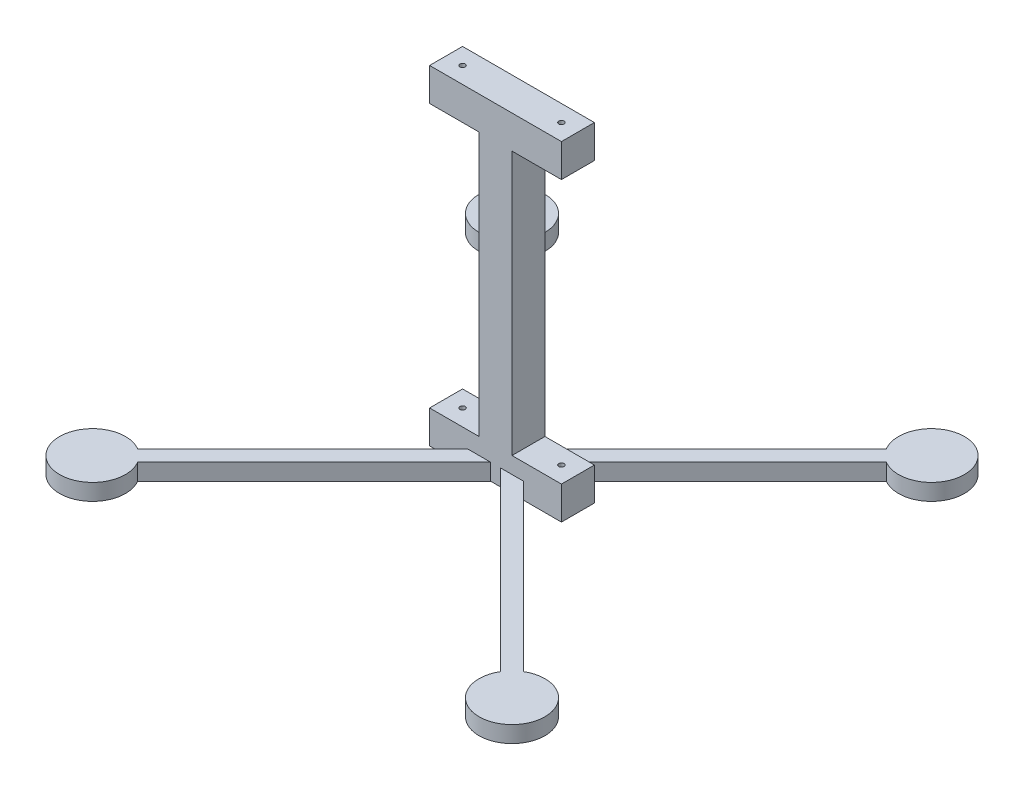
ISO-10303-21;
HEADER;
FILE_DESCRIPTION(('STEP AP214'),'2;1');
FILE_NAME('part.step','',(''),(''),'','','');
FILE_SCHEMA(('AUTOMOTIVE_DESIGN { 1 0 10303 214 1 1 1 1 }'));
ENDSEC;
DATA;
#1=APPLICATION_CONTEXT('core data for automotive mechanical design processes');
#2=APPLICATION_PROTOCOL_DEFINITION('international standard','automotive_design',2000,#1);
#3=PRODUCT_CONTEXT('',#1,'mechanical');
#4=PRODUCT('Part','Part','',(#3));
#5=PRODUCT_RELATED_PRODUCT_CATEGORY('part','',(#4));
#6=PRODUCT_DEFINITION_FORMATION('','',#4);
#7=PRODUCT_DEFINITION_CONTEXT('part definition',#1,'design');
#8=PRODUCT_DEFINITION('design','',#6,#7);
#9=PRODUCT_DEFINITION_SHAPE('','',#8);
#10=(LENGTH_UNIT() NAMED_UNIT(*) SI_UNIT(.MILLI.,.METRE.));
#11=(NAMED_UNIT(*) PLANE_ANGLE_UNIT() SI_UNIT($,.RADIAN.));
#12=(NAMED_UNIT(*) SI_UNIT($,.STERADIAN.) SOLID_ANGLE_UNIT());
#13=UNCERTAINTY_MEASURE_WITH_UNIT(LENGTH_MEASURE(1.E-05),#10,'distance_accuracy_value','');
#14=(GEOMETRIC_REPRESENTATION_CONTEXT(3) GLOBAL_UNCERTAINTY_ASSIGNED_CONTEXT((#13)) GLOBAL_UNIT_ASSIGNED_CONTEXT((#10,
#11,#12)) REPRESENTATION_CONTEXT('',''));
#15=CARTESIAN_POINT('',(0.,0.,0.));
#16=DIRECTION('',(0.,0.,1.));
#17=DIRECTION('',(1.,0.,0.));
#18=AXIS2_PLACEMENT_3D('',#15,#16,#17);
#19=CARTESIAN_POINT('',(20.,10.,5.));
#20=DIRECTION('',(-1.,0.,0.));
#21=DIRECTION('',(0.,0.,1.));
#22=AXIS2_PLACEMENT_3D('',#19,#20,#21);
#23=PLANE('',#22);
#24=DIRECTION('',(0.,1.,0.));
#25=VECTOR('',#24,1.);
#26=CARTESIAN_POINT('',(20.,10.,-5.));
#27=LINE('',#26,#25);
#28=CARTESIAN_POINT('',(20.,0.,-5.));
#29=VERTEX_POINT('',#28);
#30=CARTESIAN_POINT('',(20.,10.,-5.));
#31=VERTEX_POINT('',#30);
#32=EDGE_CURVE('E272',#29,#31,#27,.T.);
#33=ORIENTED_EDGE('',*,*,#32,.T.);
#34=DIRECTION('',(0.,0.,-1.));
#35=VECTOR('',#34,1.);
#36=CARTESIAN_POINT('',(20.,10.,5.));
#37=LINE('',#36,#35);
#38=CARTESIAN_POINT('',(20.,10.,5.));
#39=VERTEX_POINT('',#38);
#40=EDGE_CURVE('E361',#39,#31,#37,.T.);
#41=ORIENTED_EDGE('',*,*,#40,.F.);
#42=DIRECTION('',(0.,1.,0.));
#43=VECTOR('',#42,1.);
#44=CARTESIAN_POINT('',(20.,10.,5.));
#45=LINE('',#44,#43);
#46=CARTESIAN_POINT('',(20.,0.,5.));
#47=VERTEX_POINT('',#46);
#48=EDGE_CURVE('E276',#47,#39,#45,.T.);
#49=ORIENTED_EDGE('',*,*,#48,.F.);
#50=DIRECTION('',(0.,0.,-1.));
#51=VECTOR('',#50,1.);
#52=CARTESIAN_POINT('',(20.,0.,5.));
#53=LINE('',#52,#51);
#54=EDGE_CURVE('E305',#47,#29,#53,.T.);
#55=ORIENTED_EDGE('',*,*,#54,.T.);
#56=EDGE_LOOP('',(#33,#41,#49,#55));
#57=FACE_BOUND('',#56,.T.);
#58=ADVANCED_FACE('F35',(#57),#23,.F.);
#59=CARTESIAN_POINT('',(-20.,9.99999999999999,5.));
#60=DIRECTION('',(0.,-1.,0.));
#61=DIRECTION('',(1.,0.,0.));
#62=AXIS2_PLACEMENT_3D('',#59,#60,#61);
#63=PLANE('',#62);
#64=CARTESIAN_POINT('',(15.,9.99999999999997,0.));
#65=DIRECTION('',(0.,1.,0.));
#66=DIRECTION('',(-1.,0.,0.));
#67=AXIS2_PLACEMENT_3D('',#64,#65,#66);
#68=CIRCLE('',#67,0.800000000000002);
#69=CARTESIAN_POINT('',(14.2,9.99999999999997,0.));
#70=VERTEX_POINT('',#69);
#71=EDGE_CURVE('E391',#70,#70,#68,.T.);
#72=ORIENTED_EDGE('',*,*,#71,.F.);
#73=EDGE_LOOP('',(#72));
#74=FACE_BOUND('',#73,.T.);
#75=CARTESIAN_POINT('',(-15.,10.,0.));
#76=DIRECTION('',(0.,1.,0.));
#77=DIRECTION('',(1.,0.,0.));
#78=AXIS2_PLACEMENT_3D('',#75,#76,#77);
#79=CIRCLE('',#78,0.799999999999999);
#80=CARTESIAN_POINT('',(-14.2,10.,0.));
#81=VERTEX_POINT('',#80);
#82=EDGE_CURVE('E398',#81,#81,#79,.T.);
#83=ORIENTED_EDGE('',*,*,#82,.F.);
#84=EDGE_LOOP('',(#83));
#85=FACE_BOUND('',#84,.T.);
#86=DIRECTION('',(-1.,0.,0.));
#87=VECTOR('',#86,1.);
#88=CARTESIAN_POINT('',(-20.,9.99999999999999,-5.));
#89=LINE('',#88,#87);
#90=CARTESIAN_POINT('',(-20.,9.99999999999999,-5.));
#91=VERTEX_POINT('',#90);
#92=EDGE_CURVE('E308',#31,#91,#89,.T.);
#93=ORIENTED_EDGE('',*,*,#92,.T.);
#94=DIRECTION('',(0.,0.,-1.));
#95=VECTOR('',#94,1.);
#96=CARTESIAN_POINT('',(-20.,9.99999999999999,5.));
#97=LINE('',#96,#95);
#98=CARTESIAN_POINT('',(-20.,9.99999999999999,5.));
#99=VERTEX_POINT('',#98);
#100=EDGE_CURVE('E358',#99,#91,#97,.T.);
#101=ORIENTED_EDGE('',*,*,#100,.F.);
#102=DIRECTION('',(-1.,0.,0.));
#103=VECTOR('',#102,1.);
#104=CARTESIAN_POINT('',(-20.,9.99999999999999,5.));
#105=LINE('',#104,#103);
#106=EDGE_CURVE('E279',#39,#99,#105,.T.);
#107=ORIENTED_EDGE('',*,*,#106,.F.);
#108=ORIENTED_EDGE('',*,*,#40,.T.);
#109=EDGE_LOOP('',(#93,#101,#107,#108));
#110=FACE_BOUND('',#109,.T.);
#111=ADVANCED_FACE('F508',(#74,#85,#110),#63,.F.);
#112=CARTESIAN_POINT('',(-20.,9.99999999999999,5.));
#113=DIRECTION('',(1.,0.,0.));
#114=DIRECTION('',(0.,0.,-1.));
#115=AXIS2_PLACEMENT_3D('',#112,#113,#114);
#116=PLANE('',#115);
#117=DIRECTION('',(0.,-1.,0.));
#118=VECTOR('',#117,1.);
#119=CARTESIAN_POINT('',(-20.,9.99999999999999,-5.));
#120=LINE('',#119,#118);
#121=CARTESIAN_POINT('',(-20.,0.,-5.));
#122=VERTEX_POINT('',#121);
#123=EDGE_CURVE('E310',#91,#122,#120,.T.);
#124=ORIENTED_EDGE('',*,*,#123,.T.);
#125=DIRECTION('',(0.,0.,-1.));
#126=VECTOR('',#125,1.);
#127=CARTESIAN_POINT('',(-20.,0.,5.));
#128=LINE('',#127,#126);
#129=CARTESIAN_POINT('',(-20.,0.,5.));
#130=VERTEX_POINT('',#129);
#131=EDGE_CURVE('E355',#130,#122,#128,.T.);
#132=ORIENTED_EDGE('',*,*,#131,.F.);
#133=DIRECTION('',(0.,-1.,0.));
#134=VECTOR('',#133,1.);
#135=CARTESIAN_POINT('',(-20.,9.99999999999999,5.));
#136=LINE('',#135,#134);
#137=EDGE_CURVE('E282',#99,#130,#136,.T.);
#138=ORIENTED_EDGE('',*,*,#137,.F.);
#139=ORIENTED_EDGE('',*,*,#100,.T.);
#140=EDGE_LOOP('',(#124,#132,#138,#139));
#141=FACE_BOUND('',#140,.T.);
#142=ADVANCED_FACE('F513',(#141),#116,.F.);
#143=CARTESIAN_POINT('',(-20.,0.,5.));
#144=DIRECTION('',(0.,1.,0.));
#145=DIRECTION('',(-1.,0.,0.));
#146=AXIS2_PLACEMENT_3D('',#143,#144,#145);
#147=PLANE('',#146);
#148=CARTESIAN_POINT('',(-15.,0.,0.));
#149=DIRECTION('',(0.,1.,0.));
#150=DIRECTION('',(-1.,0.,0.));
#151=AXIS2_PLACEMENT_3D('',#148,#149,#150);
#152=CIRCLE('',#151,0.799999999999999);
#153=CARTESIAN_POINT('',(-15.8,0.,0.));
#154=VERTEX_POINT('',#153);
#155=EDGE_CURVE('E410',#154,#154,#152,.T.);
#156=ORIENTED_EDGE('',*,*,#155,.T.);
#157=EDGE_LOOP('',(#156));
#158=FACE_BOUND('',#157,.T.);
#159=DIRECTION('',(1.,0.,0.));
#160=VECTOR('',#159,1.);
#161=CARTESIAN_POINT('',(-20.,0.,-5.));
#162=LINE('',#161,#160);
#163=CARTESIAN_POINT('',(-4.99999999999998,0.,-5.));
#164=VERTEX_POINT('',#163);
#165=EDGE_CURVE('E312',#122,#164,#162,.T.);
#166=ORIENTED_EDGE('',*,*,#165,.T.);
#167=DIRECTION('',(0.,0.,-1.));
#168=VECTOR('',#167,1.);
#169=CARTESIAN_POINT('',(-4.99999999999998,0.,5.));
#170=LINE('',#169,#168);
#171=CARTESIAN_POINT('',(-4.99999999999998,0.,5.));
#172=VERTEX_POINT('',#171);
#173=EDGE_CURVE('E352',#172,#164,#170,.T.);
#174=ORIENTED_EDGE('',*,*,#173,.F.);
#175=DIRECTION('',(1.,0.,0.));
#176=VECTOR('',#175,1.);
#177=CARTESIAN_POINT('',(-20.,0.,5.));
#178=LINE('',#177,#176);
#179=EDGE_CURVE('E284',#130,#172,#178,.T.);
#180=ORIENTED_EDGE('',*,*,#179,.F.);
#181=ORIENTED_EDGE('',*,*,#131,.T.);
#182=EDGE_LOOP('',(#166,#174,#180,#181));
#183=FACE_BOUND('',#182,.T.);
#184=ADVANCED_FACE('F560',(#158,#183),#147,.F.);
#185=CARTESIAN_POINT('',(-4.99999999999998,0.,5.));
#186=DIRECTION('',(1.,0.,0.));
#187=DIRECTION('',(0.,1.,0.));
#188=AXIS2_PLACEMENT_3D('',#185,#186,#187);
#189=PLANE('',#188);
#190=DIRECTION('',(0.,-1.,0.));
#191=VECTOR('',#190,1.);
#192=CARTESIAN_POINT('',(-4.99999999999998,0.,-5.));
#193=LINE('',#192,#191);
#194=CARTESIAN_POINT('',(-4.99999999999997,-80.,-5.));
#195=VERTEX_POINT('',#194);
#196=EDGE_CURVE('E314',#164,#195,#193,.T.);
#197=ORIENTED_EDGE('',*,*,#196,.T.);
#198=DIRECTION('',(0.,0.,-1.));
#199=VECTOR('',#198,1.);
#200=CARTESIAN_POINT('',(-4.99999999999997,-80.,5.));
#201=LINE('',#200,#199);
#202=CARTESIAN_POINT('',(-4.99999999999997,-80.,5.));
#203=VERTEX_POINT('',#202);
#204=EDGE_CURVE('E349',#203,#195,#201,.T.);
#205=ORIENTED_EDGE('',*,*,#204,.F.);
#206=DIRECTION('',(0.,-1.,0.));
#207=VECTOR('',#206,1.);
#208=CARTESIAN_POINT('',(-4.99999999999998,0.,5.));
#209=LINE('',#208,#207);
#210=EDGE_CURVE('E286',#172,#203,#209,.T.);
#211=ORIENTED_EDGE('',*,*,#210,.F.);
#212=ORIENTED_EDGE('',*,*,#173,.T.);
#213=EDGE_LOOP('',(#197,#205,#211,#212));
#214=FACE_BOUND('',#213,.T.);
#215=ADVANCED_FACE('F556',(#214),#189,.F.);
#216=CARTESIAN_POINT('',(-4.99999999999997,-80.,5.));
#217=DIRECTION('',(0.,-1.,0.));
#218=DIRECTION('',(0.,0.,-1.));
#219=AXIS2_PLACEMENT_3D('',#216,#217,#218);
#220=PLANE('',#219);
#221=CARTESIAN_POINT('',(-15.0000000000002,-80.,0.));
#222=DIRECTION('',(0.,-1.,0.));
#223=DIRECTION('',(0.,0.,-1.));
#224=AXIS2_PLACEMENT_3D('',#221,#222,#223);
#225=CIRCLE('',#224,0.799999999999999);
#226=CARTESIAN_POINT('',(-15.0000000000002,-80.,-0.799999999999999));
#227=VERTEX_POINT('',#226);
#228=EDGE_CURVE('E407',#227,#227,#225,.T.);
#229=ORIENTED_EDGE('',*,*,#228,.T.);
#230=EDGE_LOOP('',(#229));
#231=FACE_BOUND('',#230,.T.);
#232=DIRECTION('',(-1.,0.,0.));
#233=VECTOR('',#232,1.);
#234=CARTESIAN_POINT('',(-4.99999999999997,-80.,-5.));
#235=LINE('',#234,#233);
#236=CARTESIAN_POINT('',(-20.,-80.,-5.));
#237=VERTEX_POINT('',#236);
#238=EDGE_CURVE('E316',#195,#237,#235,.T.);
#239=ORIENTED_EDGE('',*,*,#238,.T.);
#240=DIRECTION('',(0.,0.,-1.));
#241=VECTOR('',#240,1.);
#242=CARTESIAN_POINT('',(-20.,-80.,5.));
#243=LINE('',#242,#241);
#244=CARTESIAN_POINT('',(-20.,-80.,5.));
#245=VERTEX_POINT('',#244);
#246=EDGE_CURVE('E346',#245,#237,#243,.T.);
#247=ORIENTED_EDGE('',*,*,#246,.F.);
#248=DIRECTION('',(-1.,0.,0.));
#249=VECTOR('',#248,1.);
#250=CARTESIAN_POINT('',(-4.99999999999997,-80.,5.));
#251=LINE('',#250,#249);
#252=EDGE_CURVE('E288',#203,#245,#251,.T.);
#253=ORIENTED_EDGE('',*,*,#252,.F.);
#254=ORIENTED_EDGE('',*,*,#204,.T.);
#255=EDGE_LOOP('',(#239,#247,#253,#254));
#256=FACE_BOUND('',#255,.T.);
#257=ADVANCED_FACE('F552',(#231,#256),#220,.F.);
#258=CARTESIAN_POINT('',(-20.,-80.,5.));
#259=DIRECTION('',(1.,0.,0.));
#260=DIRECTION('',(0.,1.,0.));
#261=AXIS2_PLACEMENT_3D('',#258,#259,#260);
#262=PLANE('',#261);
#263=DIRECTION('',(0.,-1.,0.));
#264=VECTOR('',#263,1.);
#265=CARTESIAN_POINT('',(-20.,-80.,-5.));
#266=LINE('',#265,#264);
#267=CARTESIAN_POINT('',(-20.,-90.,-5.));
#268=VERTEX_POINT('',#267);
#269=EDGE_CURVE('E318',#237,#268,#266,.T.);
#270=ORIENTED_EDGE('',*,*,#269,.T.);
#271=DIRECTION('',(0.,0.,-1.));
#272=VECTOR('',#271,1.);
#273=CARTESIAN_POINT('',(-20.,-90.,5.));
#274=LINE('',#273,#272);
#275=CARTESIAN_POINT('',(-20.,-90.,5.));
#276=VERTEX_POINT('',#275);
#277=EDGE_CURVE('E344',#276,#268,#274,.T.);
#278=ORIENTED_EDGE('',*,*,#277,.F.);
#279=DIRECTION('',(0.,-1.,0.));
#280=VECTOR('',#279,1.);
#281=CARTESIAN_POINT('',(-20.,-80.,5.));
#282=LINE('',#281,#280);
#283=EDGE_CURVE('E290',#245,#276,#282,.T.);
#284=ORIENTED_EDGE('',*,*,#283,.F.);
#285=ORIENTED_EDGE('',*,*,#246,.T.);
#286=EDGE_LOOP('',(#270,#278,#284,#285));
#287=FACE_BOUND('',#286,.T.);
#288=ADVANCED_FACE('F548',(#287),#262,.F.);
#289=CARTESIAN_POINT('',(20.,-90.,5.));
#290=DIRECTION('',(0.,1.,0.));
#291=DIRECTION('',(0.,0.,1.));
#292=AXIS2_PLACEMENT_3D('',#289,#290,#291);
#293=PLANE('',#292);
#294=CARTESIAN_POINT('',(14.9999999999998,-90.,0.));
#295=DIRECTION('',(0.,1.,0.));
#296=DIRECTION('',(0.,0.,1.));
#297=AXIS2_PLACEMENT_3D('',#294,#295,#296);
#298=CIRCLE('',#297,0.800000000000002);
#299=CARTESIAN_POINT('',(14.9999999999998,-90.,0.800000000000002));
#300=VERTEX_POINT('',#299);
#301=EDGE_CURVE('E395',#300,#300,#298,.T.);
#302=ORIENTED_EDGE('',*,*,#301,.T.);
#303=EDGE_LOOP('',(#302));
#304=FACE_BOUND('',#303,.T.);
#305=CARTESIAN_POINT('',(-15.0000000000002,-90.,0.));
#306=DIRECTION('',(0.,1.,0.));
#307=DIRECTION('',(0.,0.,1.));
#308=AXIS2_PLACEMENT_3D('',#305,#306,#307);
#309=CIRCLE('',#308,0.799999999999999);
#310=CARTESIAN_POINT('',(-15.0000000000002,-90.,0.799999999999999));
#311=VERTEX_POINT('',#310);
#312=EDGE_CURVE('E38',#311,#311,#309,.T.);
#313=ORIENTED_EDGE('',*,*,#312,.T.);
#314=EDGE_LOOP('',(#313));
#315=FACE_BOUND('',#314,.T.);
#316=DIRECTION('',(-0.707106781186551,0.,-0.707106781186544));
#317=VECTOR('',#316,1.);
#318=CARTESIAN_POINT('',(-65.4073772597557,-90.0000000000002,-61.8718433538226));
#319=LINE('',#318,#317);
#320=CARTESIAN_POINT('',(-8.53553390593249,-90.,-5.));
#321=VERTEX_POINT('',#320);
#322=CARTESIAN_POINT('',(-58.5608452909413,-90.,-55.0253113850083));
#323=VERTEX_POINT('',#322);
#324=EDGE_CURVE('E231',#321,#323,#319,.T.);
#325=ORIENTED_EDGE('',*,*,#324,.T.);
#326=CARTESIAN_POINT('',(-63.6396103067881,-90.,-63.63961030679));
#327=DIRECTION('',(0.,1.,0.));
#328=DIRECTION('',(0.,0.,1.));
#329=AXIS2_PLACEMENT_3D('',#326,#327,#328);
#330=CIRCLE('',#329,9.99999999999999);
#331=CARTESIAN_POINT('',(-55.025311385008,-90.0000000000002,-58.5608452909404));
#332=VERTEX_POINT('',#331);
#333=EDGE_CURVE('E51',#323,#332,#330,.F.);
#334=ORIENTED_EDGE('',*,*,#333,.T.);
#335=DIRECTION('',(0.707106781186549,0.,0.707106781186546));
#336=VECTOR('',#335,1.);
#337=CARTESIAN_POINT('',(-61.8718433538229,-90.0000000000002,-65.4073772597553));
#338=LINE('',#337,#336);
#339=CARTESIAN_POINT('',(-1.4644660940673,-90.,-5.));
#340=VERTEX_POINT('',#339);
#341=EDGE_CURVE('E242',#332,#340,#338,.T.);
#342=ORIENTED_EDGE('',*,*,#341,.T.);
#343=DIRECTION('',(1.,0.,0.));
#344=VECTOR('',#343,1.);
#345=CARTESIAN_POINT('',(20.,-90.,-5.));
#346=LINE('',#345,#344);
#347=CARTESIAN_POINT('',(1.4644660940676,-90.,-5.));
#348=VERTEX_POINT('',#347);
#349=EDGE_CURVE('E323',#340,#348,#346,.T.);
#350=ORIENTED_EDGE('',*,*,#349,.T.);
#351=DIRECTION('',(0.707106781186551,0.,-0.707106781186544));
#352=VECTOR('',#351,1.);
#353=CARTESIAN_POINT('',(61.8718433538233,-90.0000000000002,-65.407377259755));
#354=LINE('',#353,#352);
#355=CARTESIAN_POINT('',(55.0253113850085,-90.,-58.5608452909403));
#356=VERTEX_POINT('',#355);
#357=EDGE_CURVE('E440',#348,#356,#354,.T.);
#358=ORIENTED_EDGE('',*,*,#357,.T.);
#359=CARTESIAN_POINT('',(63.6396103067893,-90.,-63.6396103067888));
#360=DIRECTION('',(0.,1.,0.));
#361=DIRECTION('',(0.,0.,1.));
#362=AXIS2_PLACEMENT_3D('',#359,#360,#361);
#363=CIRCLE('',#362,9.99999999999999);
#364=CARTESIAN_POINT('',(58.5608452909404,-89.9999999999998,-55.0253113850082));
#365=VERTEX_POINT('',#364);
#366=EDGE_CURVE('E58',#356,#365,#363,.F.);
#367=ORIENTED_EDGE('',*,*,#366,.T.);
#368=DIRECTION('',(-0.707106781186546,0.,0.707106781186549));
#369=VECTOR('',#368,1.);
#370=CARTESIAN_POINT('',(-61.8718433538228,-90.0000000000002,65.4073772597554));
#371=LINE('',#370,#369);
#372=CARTESIAN_POINT('',(8.53553390593239,-90.,-5.));
#373=VERTEX_POINT('',#372);
#374=EDGE_CURVE('E252',#365,#373,#371,.T.);
#375=ORIENTED_EDGE('',*,*,#374,.T.);
#376=CARTESIAN_POINT('',(20.,-90.,-5.));
#377=VERTEX_POINT('',#376);
#378=EDGE_CURVE('E320',#373,#377,#346,.T.);
#379=ORIENTED_EDGE('',*,*,#378,.T.);
#380=DIRECTION('',(0.,0.,-1.));
#381=VECTOR('',#380,1.);
#382=CARTESIAN_POINT('',(20.,-90.,5.));
#383=LINE('',#382,#381);
#384=CARTESIAN_POINT('',(20.,-90.,5.));
#385=VERTEX_POINT('',#384);
#386=EDGE_CURVE('E341',#385,#377,#383,.T.);
#387=ORIENTED_EDGE('',*,*,#386,.F.);
#388=DIRECTION('',(1.,0.,0.));
#389=VECTOR('',#388,1.);
#390=CARTESIAN_POINT('',(20.,-90.,5.));
#391=LINE('',#390,#389);
#392=CARTESIAN_POINT('',(8.53553390593249,-90.,5.));
#393=VERTEX_POINT('',#392);
#394=EDGE_CURVE('E292',#393,#385,#391,.T.);
#395=ORIENTED_EDGE('',*,*,#394,.F.);
#396=DIRECTION('',(0.707106781186551,0.,0.707106781186544));
#397=VECTOR('',#396,1.);
#398=CARTESIAN_POINT('',(65.4073772597557,-90.0000000000002,61.8718433538226));
#399=LINE('',#398,#397);
#400=CARTESIAN_POINT('',(58.5608452909411,-90.,55.0253113850081));
#401=VERTEX_POINT('',#400);
#402=EDGE_CURVE('E269',#393,#401,#399,.T.);
#403=ORIENTED_EDGE('',*,*,#402,.T.);
#404=CARTESIAN_POINT('',(63.6396103067885,-90.,63.6396103067896));
#405=DIRECTION('',(0.,1.,0.));
#406=DIRECTION('',(0.,0.,1.));
#407=AXIS2_PLACEMENT_3D('',#404,#405,#406);
#408=CIRCLE('',#407,9.99999999999999);
#409=CARTESIAN_POINT('',(55.0253113850081,-90.,58.5608452909405));
#410=VERTEX_POINT('',#409);
#411=EDGE_CURVE('E427',#401,#410,#408,.F.);
#412=ORIENTED_EDGE('',*,*,#411,.T.);
#413=DIRECTION('',(-0.707106781186549,0.,-0.707106781186546));
#414=VECTOR('',#413,1.);
#415=CARTESIAN_POINT('',(61.8718433538229,-90.0000000000002,65.4073772597553));
#416=LINE('',#415,#414);
#417=CARTESIAN_POINT('',(1.46446609406729,-90.,5.));
#418=VERTEX_POINT('',#417);
#419=EDGE_CURVE('E265',#410,#418,#416,.T.);
#420=ORIENTED_EDGE('',*,*,#419,.T.);
#421=CARTESIAN_POINT('',(-1.46446609406759,-90.,5.00000000000001));
#422=VERTEX_POINT('',#421);
#423=EDGE_CURVE('E297',#422,#418,#391,.T.);
#424=ORIENTED_EDGE('',*,*,#423,.F.);
#425=CARTESIAN_POINT('',(-55.0253113850082,-90.,58.5608452909408));
#426=VERTEX_POINT('',#425);
#427=EDGE_CURVE('E258',#422,#426,#371,.T.);
#428=ORIENTED_EDGE('',*,*,#427,.T.);
#429=CARTESIAN_POINT('',(-63.6396103067893,-90.,63.6396103067888));
#430=DIRECTION('',(0.,1.,0.));
#431=DIRECTION('',(0.,0.,1.));
#432=AXIS2_PLACEMENT_3D('',#429,#430,#431);
#433=CIRCLE('',#432,9.99999999999999);
#434=CARTESIAN_POINT('',(-58.5608452909408,-90.,55.025311385008));
#435=VERTEX_POINT('',#434);
#436=EDGE_CURVE('E417',#426,#435,#433,.F.);
#437=ORIENTED_EDGE('',*,*,#436,.T.);
#438=DIRECTION('',(0.707106781186548,0.,-0.707106781186547));
#439=VECTOR('',#438,1.);
#440=CARTESIAN_POINT('',(-65.4073772597556,-90.0000000000002,61.8718433538227));
#441=LINE('',#440,#439);
#442=CARTESIAN_POINT('',(-8.53553390593272,-90.,5.));
#443=VERTEX_POINT('',#442);
#444=EDGE_CURVE('E256',#435,#443,#441,.T.);
#445=ORIENTED_EDGE('',*,*,#444,.T.);
#446=EDGE_CURVE('E293',#276,#443,#391,.T.);
#447=ORIENTED_EDGE('',*,*,#446,.F.);
#448=ORIENTED_EDGE('',*,*,#277,.T.);
#449=EDGE_CURVE('E240',#268,#321,#346,.T.);
#450=ORIENTED_EDGE('',*,*,#449,.T.);
#451=EDGE_LOOP('',(#325,#334,#342,#350,#358,#367,#375,#379,#387,#395,#403,#412,#420,#424,#428,
#437,#445,#447,#448,#450));
#452=FACE_BOUND('',#451,.T.);
#453=ADVANCED_FACE('F237',(#304,#315,#452),#293,.F.);
#454=CARTESIAN_POINT('',(20.,-80.,5.));
#455=DIRECTION('',(-1.,0.,0.));
#456=DIRECTION('',(0.,-1.,0.));
#457=AXIS2_PLACEMENT_3D('',#454,#455,#456);
#458=PLANE('',#457);
#459=DIRECTION('',(0.,1.,0.));
#460=VECTOR('',#459,1.);
#461=CARTESIAN_POINT('',(20.,-80.,-5.));
#462=LINE('',#461,#460);
#463=CARTESIAN_POINT('',(20.,-80.,-5.));
#464=VERTEX_POINT('',#463);
#465=EDGE_CURVE('E322',#377,#464,#462,.T.);
#466=ORIENTED_EDGE('',*,*,#465,.T.);
#467=DIRECTION('',(0.,0.,-1.));
#468=VECTOR('',#467,1.);
#469=CARTESIAN_POINT('',(20.,-80.,5.));
#470=LINE('',#469,#468);
#471=CARTESIAN_POINT('',(20.,-80.,5.));
#472=VERTEX_POINT('',#471);
#473=EDGE_CURVE('E338',#472,#464,#470,.T.);
#474=ORIENTED_EDGE('',*,*,#473,.F.);
#475=DIRECTION('',(0.,1.,0.));
#476=VECTOR('',#475,1.);
#477=CARTESIAN_POINT('',(20.,-80.,5.));
#478=LINE('',#477,#476);
#479=EDGE_CURVE('E296',#385,#472,#478,.T.);
#480=ORIENTED_EDGE('',*,*,#479,.F.);
#481=ORIENTED_EDGE('',*,*,#386,.T.);
#482=EDGE_LOOP('',(#466,#474,#480,#481));
#483=FACE_BOUND('',#482,.T.);
#484=ADVANCED_FACE('F470',(#483),#458,.F.);
#485=CARTESIAN_POINT('',(5.00000000000003,-80.,5.));
#486=DIRECTION('',(0.,-1.,0.));
#487=DIRECTION('',(0.,0.,-1.));
#488=AXIS2_PLACEMENT_3D('',#485,#486,#487);
#489=PLANE('',#488);
#490=CARTESIAN_POINT('',(14.9999999999998,-80.,0.));
#491=DIRECTION('',(0.,-1.,0.));
#492=DIRECTION('',(0.,0.,-1.));
#493=AXIS2_PLACEMENT_3D('',#490,#491,#492);
#494=CIRCLE('',#493,0.800000000000002);
#495=CARTESIAN_POINT('',(14.9999999999998,-80.,-0.800000000000002));
#496=VERTEX_POINT('',#495);
#497=EDGE_CURVE('E390',#496,#496,#494,.T.);
#498=ORIENTED_EDGE('',*,*,#497,.T.);
#499=EDGE_LOOP('',(#498));
#500=FACE_BOUND('',#499,.T.);
#501=DIRECTION('',(-1.,0.,0.));
#502=VECTOR('',#501,1.);
#503=CARTESIAN_POINT('',(5.00000000000003,-80.,-5.));
#504=LINE('',#503,#502);
#505=CARTESIAN_POINT('',(5.00000000000003,-80.,-5.));
#506=VERTEX_POINT('',#505);
#507=EDGE_CURVE('E325',#464,#506,#504,.T.);
#508=ORIENTED_EDGE('',*,*,#507,.T.);
#509=DIRECTION('',(0.,0.,-1.));
#510=VECTOR('',#509,1.);
#511=CARTESIAN_POINT('',(5.00000000000003,-80.,5.));
#512=LINE('',#511,#510);
#513=CARTESIAN_POINT('',(5.00000000000003,-80.,5.));
#514=VERTEX_POINT('',#513);
#515=EDGE_CURVE('E335',#514,#506,#512,.T.);
#516=ORIENTED_EDGE('',*,*,#515,.F.);
#517=DIRECTION('',(-1.,0.,0.));
#518=VECTOR('',#517,1.);
#519=CARTESIAN_POINT('',(5.00000000000003,-80.,5.));
#520=LINE('',#519,#518);
#521=EDGE_CURVE('E299',#472,#514,#520,.T.);
#522=ORIENTED_EDGE('',*,*,#521,.F.);
#523=ORIENTED_EDGE('',*,*,#473,.T.);
#524=EDGE_LOOP('',(#508,#516,#522,#523));
#525=FACE_BOUND('',#524,.T.);
#526=ADVANCED_FACE('F534',(#500,#525),#489,.F.);
#527=CARTESIAN_POINT('',(5.00000000000002,0.,5.));
#528=DIRECTION('',(-1.,0.,0.));
#529=DIRECTION('',(0.,-1.,0.));
#530=AXIS2_PLACEMENT_3D('',#527,#528,#529);
#531=PLANE('',#530);
#532=DIRECTION('',(0.,1.,0.));
#533=VECTOR('',#532,1.);
#534=CARTESIAN_POINT('',(5.00000000000002,0.,-5.));
#535=LINE('',#534,#533);
#536=CARTESIAN_POINT('',(5.00000000000002,0.,-5.));
#537=VERTEX_POINT('',#536);
#538=EDGE_CURVE('E327',#506,#537,#535,.T.);
#539=ORIENTED_EDGE('',*,*,#538,.T.);
#540=DIRECTION('',(0.,0.,-1.));
#541=VECTOR('',#540,1.);
#542=CARTESIAN_POINT('',(5.00000000000002,0.,5.));
#543=LINE('',#542,#541);
#544=CARTESIAN_POINT('',(5.00000000000002,0.,5.));
#545=VERTEX_POINT('',#544);
#546=EDGE_CURVE('E332',#545,#537,#543,.T.);
#547=ORIENTED_EDGE('',*,*,#546,.F.);
#548=DIRECTION('',(0.,1.,0.));
#549=VECTOR('',#548,1.);
#550=CARTESIAN_POINT('',(5.00000000000002,0.,5.));
#551=LINE('',#550,#549);
#552=EDGE_CURVE('E301',#514,#545,#551,.T.);
#553=ORIENTED_EDGE('',*,*,#552,.F.);
#554=ORIENTED_EDGE('',*,*,#515,.T.);
#555=EDGE_LOOP('',(#539,#547,#553,#554));
#556=FACE_BOUND('',#555,.T.);
#557=ADVANCED_FACE('F532',(#556),#531,.F.);
#558=CARTESIAN_POINT('',(20.,0.,5.));
#559=DIRECTION('',(0.,1.,0.));
#560=DIRECTION('',(-1.,0.,0.));
#561=AXIS2_PLACEMENT_3D('',#558,#559,#560);
#562=PLANE('',#561);
#563=CARTESIAN_POINT('',(15.,0.,0.));
#564=DIRECTION('',(0.,1.,0.));
#565=DIRECTION('',(-1.,0.,0.));
#566=AXIS2_PLACEMENT_3D('',#563,#564,#565);
#567=CIRCLE('',#566,0.800000000000002);
#568=CARTESIAN_POINT('',(14.2,0.,0.));
#569=VERTEX_POINT('',#568);
#570=EDGE_CURVE('E388',#569,#569,#567,.T.);
#571=ORIENTED_EDGE('',*,*,#570,.T.);
#572=EDGE_LOOP('',(#571));
#573=FACE_BOUND('',#572,.T.);
#574=DIRECTION('',(1.,0.,0.));
#575=VECTOR('',#574,1.);
#576=CARTESIAN_POINT('',(20.,0.,-5.));
#577=LINE('',#576,#575);
#578=EDGE_CURVE('E280',#537,#29,#577,.T.);
#579=ORIENTED_EDGE('',*,*,#578,.T.);
#580=ORIENTED_EDGE('',*,*,#54,.F.);
#581=DIRECTION('',(1.,0.,0.));
#582=VECTOR('',#581,1.);
#583=CARTESIAN_POINT('',(20.,0.,5.));
#584=LINE('',#583,#582);
#585=EDGE_CURVE('E303',#545,#47,#584,.T.);
#586=ORIENTED_EDGE('',*,*,#585,.F.);
#587=ORIENTED_EDGE('',*,*,#546,.T.);
#588=EDGE_LOOP('',(#579,#580,#586,#587));
#589=FACE_BOUND('',#588,.T.);
#590=ADVANCED_FACE('F530',(#573,#589),#562,.F.);
#591=CARTESIAN_POINT('',(0.,0.,5.));
#592=DIRECTION('',(0.,0.,-1.));
#593=DIRECTION('',(-1.,0.,0.));
#594=AXIS2_PLACEMENT_3D('',#591,#592,#593);
#595=PLANE('',#594);
#596=ORIENTED_EDGE('',*,*,#446,.T.);
#597=DIRECTION('',(0.,1.,0.));
#598=VECTOR('',#597,1.);
#599=CARTESIAN_POINT('',(-8.5355339059324,0.,5.));
#600=LINE('',#599,#598);
#601=CARTESIAN_POINT('',(-8.53553390593272,-85.,5.));
#602=VERTEX_POINT('',#601);
#603=EDGE_CURVE('E43',#443,#602,#600,.T.);
#604=ORIENTED_EDGE('',*,*,#603,.T.);
#605=DIRECTION('',(-1.,0.,0.));
#606=VECTOR('',#605,1.);
#607=CARTESIAN_POINT('',(1.48286509986794E-13,-85.,5.));
#608=LINE('',#607,#606);
#609=CARTESIAN_POINT('',(-1.46446609406758,-85.,5.00000000000001));
#610=VERTEX_POINT('',#609);
#611=EDGE_CURVE('E255',#610,#602,#608,.T.);
#612=ORIENTED_EDGE('',*,*,#611,.F.);
#613=DIRECTION('',(0.,-1.,0.));
#614=VECTOR('',#613,1.);
#615=CARTESIAN_POINT('',(-1.46446609406725,0.,5.));
#616=LINE('',#615,#614);
#617=EDGE_CURVE('E262',#610,#422,#616,.T.);
#618=ORIENTED_EDGE('',*,*,#617,.T.);
#619=ORIENTED_EDGE('',*,*,#423,.T.);
#620=DIRECTION('',(0.,1.,0.));
#621=VECTOR('',#620,1.);
#622=CARTESIAN_POINT('',(1.46446609406763,0.,5.));
#623=LINE('',#622,#621);
#624=CARTESIAN_POINT('',(1.46446609406733,-85.,5.));
#625=VERTEX_POINT('',#624);
#626=EDGE_CURVE('E370',#418,#625,#623,.T.);
#627=ORIENTED_EDGE('',*,*,#626,.T.);
#628=DIRECTION('',(-1.,0.,0.));
#629=VECTOR('',#628,1.);
#630=CARTESIAN_POINT('',(-1.48286509986809E-13,-85.,5.));
#631=LINE('',#630,#629);
#632=CARTESIAN_POINT('',(8.53553390593251,-85.,5.));
#633=VERTEX_POINT('',#632);
#634=EDGE_CURVE('E364',#633,#625,#631,.T.);
#635=ORIENTED_EDGE('',*,*,#634,.F.);
#636=DIRECTION('',(0.,-1.,0.));
#637=VECTOR('',#636,1.);
#638=CARTESIAN_POINT('',(8.53553390593282,0.,5.));
#639=LINE('',#638,#637);
#640=EDGE_CURVE('E367',#633,#393,#639,.T.);
#641=ORIENTED_EDGE('',*,*,#640,.T.);
#642=ORIENTED_EDGE('',*,*,#394,.T.);
#643=ORIENTED_EDGE('',*,*,#479,.T.);
#644=ORIENTED_EDGE('',*,*,#521,.T.);
#645=ORIENTED_EDGE('',*,*,#552,.T.);
#646=ORIENTED_EDGE('',*,*,#585,.T.);
#647=ORIENTED_EDGE('',*,*,#48,.T.);
#648=ORIENTED_EDGE('',*,*,#106,.T.);
#649=ORIENTED_EDGE('',*,*,#137,.T.);
#650=ORIENTED_EDGE('',*,*,#179,.T.);
#651=ORIENTED_EDGE('',*,*,#210,.T.);
#652=ORIENTED_EDGE('',*,*,#252,.T.);
#653=ORIENTED_EDGE('',*,*,#283,.T.);
#654=EDGE_LOOP('',(#596,#604,#612,#618,#619,#627,#635,#641,#642,#643,#644,#645,#646,#647,#648,
#649,#650,#651,#652,#653));
#655=FACE_BOUND('',#654,.T.);
#656=ADVANCED_FACE('F474',(#655),#595,.F.);
#657=CARTESIAN_POINT('',(0.,0.,-5.));
#658=DIRECTION('',(0.,0.,-1.));
#659=DIRECTION('',(-1.,0.,0.));
#660=AXIS2_PLACEMENT_3D('',#657,#658,#659);
#661=PLANE('',#660);
#662=DIRECTION('',(0.,-1.,0.));
#663=VECTOR('',#662,1.);
#664=CARTESIAN_POINT('',(-1.46446609406763,0.,-5.));
#665=LINE('',#664,#663);
#666=CARTESIAN_POINT('',(-1.46446609406733,-85.,-5.));
#667=VERTEX_POINT('',#666);
#668=EDGE_CURVE('E384',#667,#340,#665,.T.);
#669=ORIENTED_EDGE('',*,*,#668,.F.);
#670=DIRECTION('',(-1.,0.,0.));
#671=VECTOR('',#670,1.);
#672=CARTESIAN_POINT('',(1.48286509986794E-13,-85.,-5.));
#673=LINE('',#672,#671);
#674=CARTESIAN_POINT('',(-8.53553390593251,-85.,-5.));
#675=VERTEX_POINT('',#674);
#676=EDGE_CURVE('E379',#667,#675,#673,.T.);
#677=ORIENTED_EDGE('',*,*,#676,.T.);
#678=DIRECTION('',(0.,1.,0.));
#679=VECTOR('',#678,1.);
#680=CARTESIAN_POINT('',(-8.53553390593282,0.,-5.));
#681=LINE('',#680,#679);
#682=EDGE_CURVE('E382',#321,#675,#681,.T.);
#683=ORIENTED_EDGE('',*,*,#682,.F.);
#684=ORIENTED_EDGE('',*,*,#449,.F.);
#685=ORIENTED_EDGE('',*,*,#269,.F.);
#686=ORIENTED_EDGE('',*,*,#238,.F.);
#687=ORIENTED_EDGE('',*,*,#196,.F.);
#688=ORIENTED_EDGE('',*,*,#165,.F.);
#689=ORIENTED_EDGE('',*,*,#123,.F.);
#690=ORIENTED_EDGE('',*,*,#92,.F.);
#691=ORIENTED_EDGE('',*,*,#32,.F.);
#692=ORIENTED_EDGE('',*,*,#578,.F.);
#693=ORIENTED_EDGE('',*,*,#538,.F.);
#694=ORIENTED_EDGE('',*,*,#507,.F.);
#695=ORIENTED_EDGE('',*,*,#465,.F.);
#696=ORIENTED_EDGE('',*,*,#378,.F.);
#697=DIRECTION('',(0.,-1.,0.));
#698=VECTOR('',#697,1.);
#699=CARTESIAN_POINT('',(8.53553390593272,0.,-5.));
#700=LINE('',#699,#698);
#701=CARTESIAN_POINT('',(8.53553390593242,-85.,-5.00000000000001));
#702=VERTEX_POINT('',#701);
#703=EDGE_CURVE('E378',#702,#373,#700,.T.);
#704=ORIENTED_EDGE('',*,*,#703,.F.);
#705=CARTESIAN_POINT('',(1.46446609406761,-85.,-5.));
#706=VERTEX_POINT('',#705);
#707=EDGE_CURVE('E376',#702,#706,#673,.T.);
#708=ORIENTED_EDGE('',*,*,#707,.T.);
#709=DIRECTION('',(0.,1.,0.));
#710=VECTOR('',#709,1.);
#711=CARTESIAN_POINT('',(1.46446609406728,0.,-5.));
#712=LINE('',#711,#710);
#713=EDGE_CURVE('E373',#348,#706,#712,.T.);
#714=ORIENTED_EDGE('',*,*,#713,.F.);
#715=ORIENTED_EDGE('',*,*,#349,.F.);
#716=EDGE_LOOP('',(#669,#677,#683,#684,#685,#686,#687,#688,#689,#690,#691,#692,#693,#694,#695,
#696,#704,#708,#714,#715));
#717=FACE_BOUND('',#716,.T.);
#718=ADVANCED_FACE('F464',(#717),#661,.T.);
#719=CARTESIAN_POINT('',(61.871843353823,-85.0000000000002,65.4073772597553));
#720=DIRECTION('',(-0.707106781186546,0.,0.707106781186549));
#721=DIRECTION('',(0.707106781186549,0.,0.707106781186546));
#722=AXIS2_PLACEMENT_3D('',#719,#720,#721);
#723=PLANE('',#722);
#724=DIRECTION('',(0.,1.,0.));
#725=VECTOR('',#724,1.);
#726=CARTESIAN_POINT('',(55.0253113850081,-118.284271247462,58.5608452909406));
#727=LINE('',#726,#725);
#728=CARTESIAN_POINT('',(55.0253113850081,-85.,58.5608452909405));
#729=VERTEX_POINT('',#728);
#730=EDGE_CURVE('E432',#729,#410,#727,.F.);
#731=ORIENTED_EDGE('',*,*,#730,.F.);
#732=DIRECTION('',(-0.707106781186549,0.,-0.707106781186546));
#733=VECTOR('',#732,1.);
#734=CARTESIAN_POINT('',(61.871843353823,-85.0000000000002,65.4073772597553));
#735=LINE('',#734,#733);
#736=EDGE_CURVE('E266',#729,#625,#735,.T.);
#737=ORIENTED_EDGE('',*,*,#736,.T.);
#738=ORIENTED_EDGE('',*,*,#626,.F.);
#739=ORIENTED_EDGE('',*,*,#419,.F.);
#740=EDGE_LOOP('',(#731,#737,#738,#739));
#741=FACE_BOUND('',#740,.T.);
#742=ADVANCED_FACE('F486',(#741),#723,.T.);
#743=CARTESIAN_POINT('',(65.4073772597557,-85.0000000000002,61.8718433538226));
#744=DIRECTION('',(0.707106781186544,0.,-0.707106781186551));
#745=DIRECTION('',(-0.707106781186551,0.,-0.707106781186544));
#746=AXIS2_PLACEMENT_3D('',#743,#744,#745);
#747=PLANE('',#746);
#748=DIRECTION('',(0.,1.,0.));
#749=VECTOR('',#748,1.);
#750=CARTESIAN_POINT('',(58.5608452909411,-118.284271247462,55.0253113850082));
#751=LINE('',#750,#749);
#752=CARTESIAN_POINT('',(58.5608452909412,-85.,55.0253113850081));
#753=VERTEX_POINT('',#752);
#754=EDGE_CURVE('E430',#401,#753,#751,.T.);
#755=ORIENTED_EDGE('',*,*,#754,.F.);
#756=ORIENTED_EDGE('',*,*,#402,.F.);
#757=ORIENTED_EDGE('',*,*,#640,.F.);
#758=DIRECTION('',(0.707106781186551,0.,0.707106781186544));
#759=VECTOR('',#758,1.);
#760=CARTESIAN_POINT('',(65.4073772597557,-85.0000000000002,61.8718433538226));
#761=LINE('',#760,#759);
#762=EDGE_CURVE('E268',#633,#753,#761,.T.);
#763=ORIENTED_EDGE('',*,*,#762,.T.);
#764=EDGE_LOOP('',(#755,#756,#757,#763));
#765=FACE_BOUND('',#764,.T.);
#766=ADVANCED_FACE('F493',(#765),#747,.T.);
#767=CARTESIAN_POINT('',(-1.385055287913E-13,-85.,-1.57009245868369E-13));
#768=DIRECTION('',(0.,-1.,0.));
#769=DIRECTION('',(1.,0.,0.));
#770=AXIS2_PLACEMENT_3D('',#767,#768,#769);
#771=PLANE('',#770);
#772=ORIENTED_EDGE('',*,*,#736,.F.);
#773=CARTESIAN_POINT('',(63.6396103067885,-85.,63.6396103067896));
#774=DIRECTION('',(0.,1.,0.));
#775=DIRECTION('',(0.,0.,-1.));
#776=AXIS2_PLACEMENT_3D('',#773,#774,#775);
#777=CIRCLE('',#776,9.99999999999999);
#778=EDGE_CURVE('E424',#729,#753,#777,.T.);
#779=ORIENTED_EDGE('',*,*,#778,.T.);
#780=ORIENTED_EDGE('',*,*,#762,.F.);
#781=ORIENTED_EDGE('',*,*,#634,.T.);
#782=EDGE_LOOP('',(#772,#779,#780,#781));
#783=FACE_BOUND('',#782,.T.);
#784=ADVANCED_FACE('F489',(#783),#771,.F.);
#785=CARTESIAN_POINT('',(61.8718433538233,-85.0000000000002,-65.407377259755));
#786=DIRECTION('',(-0.707106781186544,0.,-0.707106781186551));
#787=DIRECTION('',(-0.707106781186551,0.,0.707106781186544));
#788=AXIS2_PLACEMENT_3D('',#785,#786,#787);
#789=PLANE('',#788);
#790=DIRECTION('',(0.,1.,0.));
#791=VECTOR('',#790,1.);
#792=CARTESIAN_POINT('',(55.0253113850086,-118.284271247462,-58.5608452909403));
#793=LINE('',#792,#791);
#794=CARTESIAN_POINT('',(55.0253113850085,-85.,-58.5608452909403));
#795=VERTEX_POINT('',#794);
#796=EDGE_CURVE('E438',#356,#795,#793,.T.);
#797=ORIENTED_EDGE('',*,*,#796,.F.);
#798=ORIENTED_EDGE('',*,*,#357,.F.);
#799=ORIENTED_EDGE('',*,*,#713,.T.);
#800=DIRECTION('',(0.707106781186551,0.,-0.707106781186544));
#801=VECTOR('',#800,1.);
#802=CARTESIAN_POINT('',(61.8718433538233,-85.0000000000002,-65.407377259755));
#803=LINE('',#802,#801);
#804=EDGE_CURVE('E245',#706,#795,#803,.T.);
#805=ORIENTED_EDGE('',*,*,#804,.T.);
#806=EDGE_LOOP('',(#797,#798,#799,#805));
#807=FACE_BOUND('',#806,.T.);
#808=ADVANCED_FACE('F448',(#807),#789,.T.);
#809=CARTESIAN_POINT('',(1.5700924586837E-13,-85.,-1.385055287913E-13));
#810=DIRECTION('',(0.,-1.,0.));
#811=DIRECTION('',(0.,0.,1.));
#812=AXIS2_PLACEMENT_3D('',#809,#810,#811);
#813=PLANE('',#812);
#814=DIRECTION('',(-0.707106781186546,0.,0.707106781186549));
#815=VECTOR('',#814,1.);
#816=CARTESIAN_POINT('',(-61.8718433538228,-85.0000000000002,65.4073772597554));
#817=LINE('',#816,#815);
#818=CARTESIAN_POINT('',(58.5608452909404,-85.,-55.0253113850082));
#819=VERTEX_POINT('',#818);
#820=EDGE_CURVE('E253',#819,#702,#817,.T.);
#821=ORIENTED_EDGE('',*,*,#820,.F.);
#822=CARTESIAN_POINT('',(63.6396103067893,-85.,-63.6396103067888));
#823=DIRECTION('',(0.,1.,0.));
#824=DIRECTION('',(-1.,0.,0.));
#825=AXIS2_PLACEMENT_3D('',#822,#823,#824);
#826=CIRCLE('',#825,9.99999999999999);
#827=EDGE_CURVE('E434',#819,#795,#826,.T.);
#828=ORIENTED_EDGE('',*,*,#827,.T.);
#829=ORIENTED_EDGE('',*,*,#804,.F.);
#830=ORIENTED_EDGE('',*,*,#707,.F.);
#831=EDGE_LOOP('',(#821,#828,#829,#830));
#832=FACE_BOUND('',#831,.T.);
#833=ADVANCED_FACE('F455',(#832),#813,.F.);
#834=CARTESIAN_POINT('',(-61.8718433538228,-85.0000000000002,65.4073772597554));
#835=DIRECTION('',(0.707106781186549,0.,0.707106781186546));
#836=DIRECTION('',(0.707106781186546,0.,-0.707106781186549));
#837=AXIS2_PLACEMENT_3D('',#834,#835,#836);
#838=PLANE('',#837);
#839=DIRECTION('',(0.,1.,0.));
#840=VECTOR('',#839,1.);
#841=CARTESIAN_POINT('',(58.5608452909404,-118.284271247462,-55.0253113850083));
#842=LINE('',#841,#840);
#843=EDGE_CURVE('E11',#819,#365,#842,.F.);
#844=ORIENTED_EDGE('',*,*,#843,.F.);
#845=ORIENTED_EDGE('',*,*,#820,.T.);
#846=ORIENTED_EDGE('',*,*,#703,.T.);
#847=ORIENTED_EDGE('',*,*,#374,.F.);
#848=EDGE_LOOP('',(#844,#845,#846,#847));
#849=FACE_BOUND('',#848,.T.);
#850=ADVANCED_FACE('F459',(#849),#838,.T.);
#851=CARTESIAN_POINT('',(-65.4073772597557,-85.0000000000002,-61.8718433538226));
#852=DIRECTION('',(-0.707106781186544,0.,0.707106781186551));
#853=DIRECTION('',(0.707106781186551,0.,0.707106781186544));
#854=AXIS2_PLACEMENT_3D('',#851,#852,#853);
#855=PLANE('',#854);
#856=DIRECTION('',(0.,1.,0.));
#857=VECTOR('',#856,1.);
#858=CARTESIAN_POINT('',(-58.5608452909412,-118.284271247462,-55.0253113850083));
#859=LINE('',#858,#857);
#860=CARTESIAN_POINT('',(-58.5608452909413,-85.,-55.0253113850083));
#861=VERTEX_POINT('',#860);
#862=EDGE_CURVE('E219',#323,#861,#859,.T.);
#863=ORIENTED_EDGE('',*,*,#862,.F.);
#864=ORIENTED_EDGE('',*,*,#324,.F.);
#865=ORIENTED_EDGE('',*,*,#682,.T.);
#866=DIRECTION('',(-0.707106781186551,0.,-0.707106781186544));
#867=VECTOR('',#866,1.);
#868=CARTESIAN_POINT('',(-65.4073772597557,-85.0000000000002,-61.8718433538226));
#869=LINE('',#868,#867);
#870=EDGE_CURVE('E233',#675,#861,#869,.T.);
#871=ORIENTED_EDGE('',*,*,#870,.T.);
#872=EDGE_LOOP('',(#863,#864,#865,#871));
#873=FACE_BOUND('',#872,.T.);
#874=ADVANCED_FACE('F229',(#873),#855,.T.);
#875=CARTESIAN_POINT('',(-61.871843353823,-85.0000000000002,-65.4073772597553));
#876=DIRECTION('',(0.707106781186546,0.,-0.707106781186549));
#877=DIRECTION('',(-0.707106781186549,0.,-0.707106781186546));
#878=AXIS2_PLACEMENT_3D('',#875,#876,#877);
#879=PLANE('',#878);
#880=DIRECTION('',(0.,1.,0.));
#881=VECTOR('',#880,1.);
#882=CARTESIAN_POINT('',(-55.025311385008,-118.284271247462,-58.5608452909405));
#883=LINE('',#882,#881);
#884=CARTESIAN_POINT('',(-55.025311385008,-85.,-58.5608452909404));
#885=VERTEX_POINT('',#884);
#886=EDGE_CURVE('E222',#885,#332,#883,.F.);
#887=ORIENTED_EDGE('',*,*,#886,.F.);
#888=DIRECTION('',(0.707106781186549,0.,0.707106781186546));
#889=VECTOR('',#888,1.);
#890=CARTESIAN_POINT('',(-61.871843353823,-85.0000000000002,-65.4073772597553));
#891=LINE('',#890,#889);
#892=EDGE_CURVE('E241',#885,#667,#891,.T.);
#893=ORIENTED_EDGE('',*,*,#892,.T.);
#894=ORIENTED_EDGE('',*,*,#668,.T.);
#895=ORIENTED_EDGE('',*,*,#341,.F.);
#896=EDGE_LOOP('',(#887,#893,#894,#895));
#897=FACE_BOUND('',#896,.T.);
#898=ADVANCED_FACE('F610',(#897),#879,.T.);
#899=ORIENTED_EDGE('',*,*,#892,.F.);
#900=CARTESIAN_POINT('',(-63.6396103067881,-85.,-63.63961030679));
#901=DIRECTION('',(0.,1.,0.));
#902=DIRECTION('',(0.,0.,1.));
#903=AXIS2_PLACEMENT_3D('',#900,#901,#902);
#904=CIRCLE('',#903,9.99999999999999);
#905=EDGE_CURVE('E224',#885,#861,#904,.T.);
#906=ORIENTED_EDGE('',*,*,#905,.T.);
#907=ORIENTED_EDGE('',*,*,#870,.F.);
#908=ORIENTED_EDGE('',*,*,#676,.F.);
#909=EDGE_LOOP('',(#899,#906,#907,#908));
#910=FACE_BOUND('',#909,.T.);
#911=ADVANCED_FACE('F603',(#910),#813,.F.);
#912=CARTESIAN_POINT('',(-65.4073772597556,-85.0000000000002,61.8718433538227));
#913=DIRECTION('',(-0.707106781186547,0.,-0.707106781186548));
#914=DIRECTION('',(-0.707106781186548,0.,0.707106781186547));
#915=AXIS2_PLACEMENT_3D('',#912,#913,#914);
#916=PLANE('',#915);
#917=DIRECTION('',(0.,1.,0.));
#918=VECTOR('',#917,1.);
#919=CARTESIAN_POINT('',(-58.5608452909409,-118.284271247462,55.025311385008));
#920=LINE('',#919,#918);
#921=CARTESIAN_POINT('',(-58.5608452909408,-85.,55.025311385008));
#922=VERTEX_POINT('',#921);
#923=EDGE_CURVE('E422',#922,#435,#920,.F.);
#924=ORIENTED_EDGE('',*,*,#923,.F.);
#925=DIRECTION('',(0.707106781186548,0.,-0.707106781186547));
#926=VECTOR('',#925,1.);
#927=CARTESIAN_POINT('',(-65.4073772597556,-85.0000000000002,61.8718433538227));
#928=LINE('',#927,#926);
#929=EDGE_CURVE('E249',#922,#602,#928,.T.);
#930=ORIENTED_EDGE('',*,*,#929,.T.);
#931=ORIENTED_EDGE('',*,*,#603,.F.);
#932=ORIENTED_EDGE('',*,*,#444,.F.);
#933=EDGE_LOOP('',(#924,#930,#931,#932));
#934=FACE_BOUND('',#933,.T.);
#935=ADVANCED_FACE('F588',(#934),#916,.T.);
#936=DIRECTION('',(0.,1.,0.));
#937=VECTOR('',#936,1.);
#938=CARTESIAN_POINT('',(-55.0253113850083,-118.284271247462,58.5608452909407));
#939=LINE('',#938,#937);
#940=CARTESIAN_POINT('',(-55.0253113850082,-85.,58.5608452909409));
#941=VERTEX_POINT('',#940);
#942=EDGE_CURVE('E420',#426,#941,#939,.T.);
#943=ORIENTED_EDGE('',*,*,#942,.F.);
#944=ORIENTED_EDGE('',*,*,#427,.F.);
#945=ORIENTED_EDGE('',*,*,#617,.F.);
#946=EDGE_CURVE('E251',#610,#941,#817,.T.);
#947=ORIENTED_EDGE('',*,*,#946,.T.);
#948=EDGE_LOOP('',(#943,#944,#945,#947));
#949=FACE_BOUND('',#948,.T.);
#950=ADVANCED_FACE('F595',(#949),#838,.T.);
#951=ORIENTED_EDGE('',*,*,#929,.F.);
#952=CARTESIAN_POINT('',(-63.6396103067893,-85.,63.6396103067888));
#953=DIRECTION('',(0.,1.,0.));
#954=DIRECTION('',(1.,0.,0.));
#955=AXIS2_PLACEMENT_3D('',#952,#953,#954);
#956=CIRCLE('',#955,9.99999999999999);
#957=EDGE_CURVE('E234',#922,#941,#956,.T.);
#958=ORIENTED_EDGE('',*,*,#957,.T.);
#959=ORIENTED_EDGE('',*,*,#946,.F.);
#960=ORIENTED_EDGE('',*,*,#611,.T.);
#961=EDGE_LOOP('',(#951,#958,#959,#960));
#962=FACE_BOUND('',#961,.T.);
#963=ADVANCED_FACE('F505',(#962),#813,.F.);
#964=CARTESIAN_POINT('',(63.6396103067893,-118.284271247462,-63.6396103067888));
#965=DIRECTION('',(0.,1.,0.));
#966=DIRECTION('',(-1.,0.,0.));
#967=AXIS2_PLACEMENT_3D('',#964,#965,#966);
#968=CYLINDRICAL_SURFACE('',#967,9.99999999999999);
#969=ORIENTED_EDGE('',*,*,#366,.F.);
#970=ORIENTED_EDGE('',*,*,#796,.T.);
#971=ORIENTED_EDGE('',*,*,#827,.F.);
#972=ORIENTED_EDGE('',*,*,#843,.T.);
#973=EDGE_LOOP('',(#969,#970,#971,#972));
#974=FACE_BOUND('',#973,.T.);
#975=ADVANCED_FACE('F451',(#974),#968,.T.);
#976=CARTESIAN_POINT('',(63.6396103067886,-118.284271247462,63.6396103067895));
#977=DIRECTION('',(0.,1.,0.));
#978=DIRECTION('',(0.,0.,1.));
#979=AXIS2_PLACEMENT_3D('',#976,#977,#978);
#980=CYLINDRICAL_SURFACE('',#979,9.99999999999999);
#981=ORIENTED_EDGE('',*,*,#778,.F.);
#982=ORIENTED_EDGE('',*,*,#730,.T.);
#983=ORIENTED_EDGE('',*,*,#411,.F.);
#984=ORIENTED_EDGE('',*,*,#754,.T.);
#985=EDGE_LOOP('',(#981,#982,#983,#984));
#986=FACE_BOUND('',#985,.T.);
#987=ADVANCED_FACE('F495',(#986),#980,.T.);
#988=CARTESIAN_POINT('',(-63.6396103067893,-118.284271247462,63.6396103067888));
#989=DIRECTION('',(0.,1.,0.));
#990=DIRECTION('',(-1.,0.,0.));
#991=AXIS2_PLACEMENT_3D('',#988,#989,#990);
#992=CYLINDRICAL_SURFACE('',#991,9.99999999999999);
#993=ORIENTED_EDGE('',*,*,#957,.F.);
#994=ORIENTED_EDGE('',*,*,#923,.T.);
#995=ORIENTED_EDGE('',*,*,#436,.F.);
#996=ORIENTED_EDGE('',*,*,#942,.T.);
#997=EDGE_LOOP('',(#993,#994,#995,#996));
#998=FACE_BOUND('',#997,.T.);
#999=ADVANCED_FACE('F497',(#998),#992,.T.);
#1000=CARTESIAN_POINT('',(-63.6396103067881,-118.284271247462,-63.63961030679));
#1001=DIRECTION('',(0.,1.,0.));
#1002=DIRECTION('',(-1.,0.,0.));
#1003=AXIS2_PLACEMENT_3D('',#1000,#1001,#1002);
#1004=CYLINDRICAL_SURFACE('',#1003,9.99999999999999);
#1005=ORIENTED_EDGE('',*,*,#333,.F.);
#1006=ORIENTED_EDGE('',*,*,#862,.T.);
#1007=ORIENTED_EDGE('',*,*,#905,.F.);
#1008=ORIENTED_EDGE('',*,*,#886,.T.);
#1009=EDGE_LOOP('',(#1005,#1006,#1007,#1008));
#1010=FACE_BOUND('',#1009,.T.);
#1011=ADVANCED_FACE('F218',(#1010),#1004,.T.);
#1012=CARTESIAN_POINT('',(14.9999999999996,-209.,0.));
#1013=DIRECTION('',(0.,1.,0.));
#1014=DIRECTION('',(-1.,0.,0.));
#1015=AXIS2_PLACEMENT_3D('',#1012,#1013,#1014);
#1016=CYLINDRICAL_SURFACE('',#1015,0.800000000000002);
#1017=ORIENTED_EDGE('',*,*,#71,.T.);
#1018=EDGE_LOOP('',(#1017));
#1019=FACE_BOUND('',#1018,.T.);
#1020=ORIENTED_EDGE('',*,*,#570,.F.);
#1021=EDGE_LOOP('',(#1020));
#1022=FACE_BOUND('',#1021,.T.);
#1023=ADVANCED_FACE('F779',(#1019,#1022),#1016,.F.);
#1024=ORIENTED_EDGE('',*,*,#497,.F.);
#1025=EDGE_LOOP('',(#1024));
#1026=FACE_BOUND('',#1025,.T.);
#1027=ORIENTED_EDGE('',*,*,#301,.F.);
#1028=EDGE_LOOP('',(#1027));
#1029=FACE_BOUND('',#1028,.T.);
#1030=ADVANCED_FACE('F784',(#1026,#1029),#1016,.F.);
#1031=CARTESIAN_POINT('',(-15.0000000000004,-209.,0.));
#1032=DIRECTION('',(0.,1.,0.));
#1033=DIRECTION('',(-1.,0.,0.));
#1034=AXIS2_PLACEMENT_3D('',#1031,#1032,#1033);
#1035=CYLINDRICAL_SURFACE('',#1034,0.799999999999999);
#1036=ORIENTED_EDGE('',*,*,#312,.F.);
#1037=EDGE_LOOP('',(#1036));
#1038=FACE_BOUND('',#1037,.T.);
#1039=ORIENTED_EDGE('',*,*,#228,.F.);
#1040=EDGE_LOOP('',(#1039));
#1041=FACE_BOUND('',#1040,.T.);
#1042=ADVANCED_FACE('F793',(#1038,#1041),#1035,.F.);
#1043=ORIENTED_EDGE('',*,*,#82,.T.);
#1044=EDGE_LOOP('',(#1043));
#1045=FACE_BOUND('',#1044,.T.);
#1046=ORIENTED_EDGE('',*,*,#155,.F.);
#1047=EDGE_LOOP('',(#1046));
#1048=FACE_BOUND('',#1047,.T.);
#1049=ADVANCED_FACE('F802',(#1045,#1048),#1035,.F.);
#1050=CLOSED_SHELL('',(#58,#111,#142,#184,#215,#257,#288,#453,#484,#526,#557,#590,#656,#718,
#742,#766,#784,#808,#833,#850,#874,#898,#911,#935,#950,#963,#975,#987,#999,#1011,#1023,#1030,
#1042,#1049));
#1051=MANIFOLD_SOLID_BREP('B2',#1050);
#1052=ADVANCED_BREP_SHAPE_REPRESENTATION('',(#18,#1051),#14);
#1053=SHAPE_DEFINITION_REPRESENTATION(#9,#1052);
ENDSEC;
END-ISO-10303-21;
